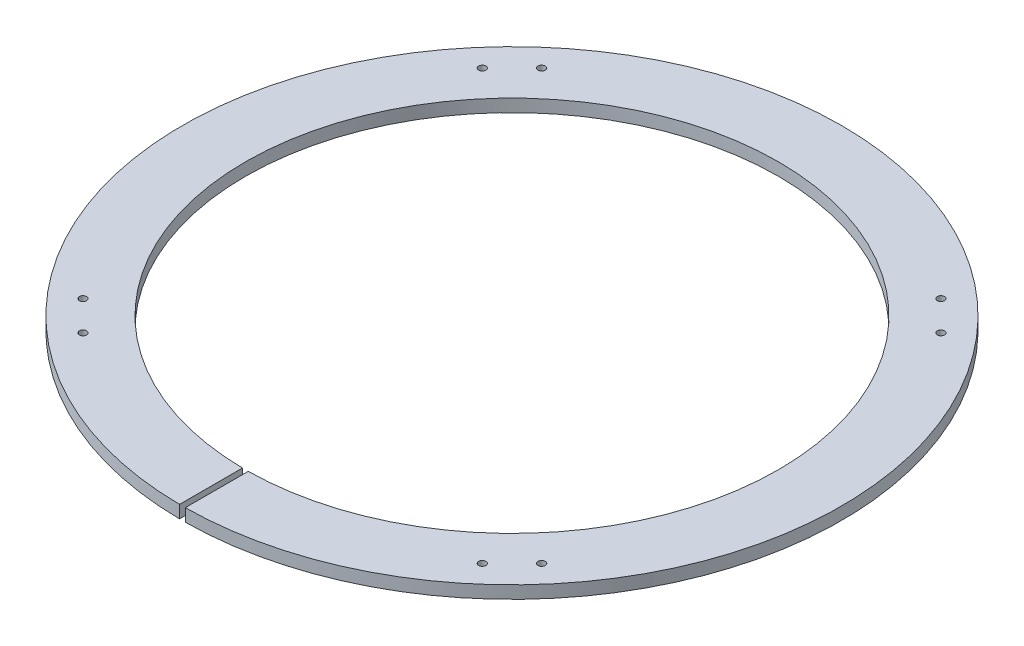
ISO-10303-21;
HEADER;
FILE_DESCRIPTION(('STEP AP214'),'2;1');
FILE_NAME('part.step','',(''),(''),'','','');
FILE_SCHEMA(('AUTOMOTIVE_DESIGN { 1 0 10303 214 1 1 1 1 }'));
ENDSEC;
DATA;
#1=APPLICATION_CONTEXT('core data for automotive mechanical design processes');
#2=APPLICATION_PROTOCOL_DEFINITION('international standard','automotive_design',2000,#1);
#3=PRODUCT_CONTEXT('',#1,'mechanical');
#4=PRODUCT('Part','Part','',(#3));
#5=PRODUCT_RELATED_PRODUCT_CATEGORY('part','',(#4));
#6=PRODUCT_DEFINITION_FORMATION('','',#4);
#7=PRODUCT_DEFINITION_CONTEXT('part definition',#1,'design');
#8=PRODUCT_DEFINITION('design','',#6,#7);
#9=PRODUCT_DEFINITION_SHAPE('','',#8);
#10=(LENGTH_UNIT() NAMED_UNIT(*) SI_UNIT(.MILLI.,.METRE.));
#11=(NAMED_UNIT(*) PLANE_ANGLE_UNIT() SI_UNIT($,.RADIAN.));
#12=(NAMED_UNIT(*) SI_UNIT($,.STERADIAN.) SOLID_ANGLE_UNIT());
#13=UNCERTAINTY_MEASURE_WITH_UNIT(LENGTH_MEASURE(1.E-05),#10,'distance_accuracy_value','');
#14=(GEOMETRIC_REPRESENTATION_CONTEXT(3) GLOBAL_UNCERTAINTY_ASSIGNED_CONTEXT((#13)) GLOBAL_UNIT_ASSIGNED_CONTEXT((#10,
#11,#12)) REPRESENTATION_CONTEXT('',''));
#15=CARTESIAN_POINT('',(0.,0.,0.));
#16=DIRECTION('',(0.,0.,1.));
#17=DIRECTION('',(1.,0.,0.));
#18=AXIS2_PLACEMENT_3D('',#15,#16,#17);
#19=CARTESIAN_POINT('',(0.,12.,0.));
#20=DIRECTION('',(0.,1.,0.));
#21=DIRECTION('',(0.,0.,1.));
#22=AXIS2_PLACEMENT_3D('',#19,#20,#21);
#23=PLANE('',#22);
#24=CARTESIAN_POINT('',(218.495995386646,12.,-190.211724139178));
#25=DIRECTION('',(0.,1.,0.));
#26=DIRECTION('',(1.,0.,0.));
#27=AXIS2_PLACEMENT_3D('',#24,#25,#26);
#28=CIRCLE('',#27,3.45);
#29=CARTESIAN_POINT('',(221.945995386646,12.,-190.211724139178));
#30=VERTEX_POINT('',#29);
#31=EDGE_CURVE('E133',#30,#30,#28,.T.);
#32=ORIENTED_EDGE('',*,*,#31,.F.);
#33=EDGE_LOOP('',(#32));
#34=FACE_BOUND('',#33,.T.);
#35=CARTESIAN_POINT('',(-218.495995386642,12.,-190.211724139182));
#36=DIRECTION('',(0.,1.,0.));
#37=DIRECTION('',(0.,0.,-1.));
#38=AXIS2_PLACEMENT_3D('',#35,#36,#37);
#39=CIRCLE('',#38,3.45);
#40=CARTESIAN_POINT('',(-218.495995386642,12.,-193.661724139182));
#41=VERTEX_POINT('',#40);
#42=EDGE_CURVE('E140',#41,#41,#39,.T.);
#43=ORIENTED_EDGE('',*,*,#42,.F.);
#44=EDGE_LOOP('',(#43));
#45=FACE_BOUND('',#44,.T.);
#46=CARTESIAN_POINT('',(-190.21172413918,12.,-218.495995386644));
#47=DIRECTION('',(0.,1.,0.));
#48=DIRECTION('',(0.,0.,-1.));
#49=AXIS2_PLACEMENT_3D('',#46,#47,#48);
#50=CIRCLE('',#49,3.45);
#51=CARTESIAN_POINT('',(-190.21172413918,12.,-221.945995386644));
#52=VERTEX_POINT('',#51);
#53=EDGE_CURVE('E121',#52,#52,#50,.T.);
#54=ORIENTED_EDGE('',*,*,#53,.F.);
#55=EDGE_LOOP('',(#54));
#56=FACE_BOUND('',#55,.T.);
#57=CARTESIAN_POINT('',(-190.211724139183,12.,218.495995386641));
#58=DIRECTION('',(0.,1.,0.));
#59=DIRECTION('',(-1.,0.,0.));
#60=AXIS2_PLACEMENT_3D('',#57,#58,#59);
#61=CIRCLE('',#60,3.45);
#62=CARTESIAN_POINT('',(-193.661724139183,12.,218.495995386641));
#63=VERTEX_POINT('',#62);
#64=EDGE_CURVE('E128',#63,#63,#61,.T.);
#65=ORIENTED_EDGE('',*,*,#64,.F.);
#66=EDGE_LOOP('',(#65));
#67=FACE_BOUND('',#66,.T.);
#68=CARTESIAN_POINT('',(190.211724139185,12.,-218.49599538664));
#69=DIRECTION('',(0.,1.,0.));
#70=DIRECTION('',(1.,0.,0.));
#71=AXIS2_PLACEMENT_3D('',#68,#69,#70);
#72=CIRCLE('',#71,3.45);
#73=CARTESIAN_POINT('',(193.661724139185,12.,-218.49599538664));
#74=VERTEX_POINT('',#73);
#75=EDGE_CURVE('E145',#74,#74,#72,.T.);
#76=ORIENTED_EDGE('',*,*,#75,.F.);
#77=EDGE_LOOP('',(#76));
#78=FACE_BOUND('',#77,.T.);
#79=CARTESIAN_POINT('',(-218.495995386645,12.,190.211724139179));
#80=DIRECTION('',(0.,1.,0.));
#81=DIRECTION('',(-1.,0.,0.));
#82=AXIS2_PLACEMENT_3D('',#79,#80,#81);
#83=CIRCLE('',#82,3.45);
#84=CARTESIAN_POINT('',(-221.945995386645,12.,190.211724139179));
#85=VERTEX_POINT('',#84);
#86=EDGE_CURVE('E115',#85,#85,#83,.T.);
#87=ORIENTED_EDGE('',*,*,#86,.F.);
#88=EDGE_LOOP('',(#87));
#89=FACE_BOUND('',#88,.T.);
#90=CARTESIAN_POINT('',(190.21172413918,12.,218.495995386644));
#91=DIRECTION('',(0.,1.,0.));
#92=DIRECTION('',(0.,0.,1.));
#93=AXIS2_PLACEMENT_3D('',#90,#91,#92);
#94=CIRCLE('',#93,3.45);
#95=CARTESIAN_POINT('',(190.21172413918,12.,221.945995386644));
#96=VERTEX_POINT('',#95);
#97=EDGE_CURVE('E110',#96,#96,#94,.T.);
#98=ORIENTED_EDGE('',*,*,#97,.F.);
#99=EDGE_LOOP('',(#98));
#100=FACE_BOUND('',#99,.T.);
#101=CARTESIAN_POINT('',(218.495995386642,12.,190.211724139182));
#102=DIRECTION('',(0.,1.,0.));
#103=DIRECTION('',(0.,0.,1.));
#104=AXIS2_PLACEMENT_3D('',#101,#102,#103);
#105=CIRCLE('',#104,3.45);
#106=CARTESIAN_POINT('',(218.495995386642,12.,193.661724139182));
#107=VERTEX_POINT('',#106);
#108=EDGE_CURVE('E103',#107,#107,#105,.T.);
#109=ORIENTED_EDGE('',*,*,#108,.F.);
#110=EDGE_LOOP('',(#109));
#111=FACE_BOUND('',#110,.T.);
#112=DIRECTION('',(0.,0.,-1.));
#113=VECTOR('',#112,1.);
#114=CARTESIAN_POINT('',(2.7449087635425,12.,234.638796625747));
#115=LINE('',#114,#113);
#116=CARTESIAN_POINT('',(2.74490876354251,12.,313.988002120909));
#117=VERTEX_POINT('',#116);
#118=CARTESIAN_POINT('',(2.7449087635425,12.,253.985167826548));
#119=VERTEX_POINT('',#118);
#120=EDGE_CURVE('E54',#117,#119,#115,.T.);
#121=ORIENTED_EDGE('',*,*,#120,.F.);
#122=CARTESIAN_POINT('',(0.,12.,0.));
#123=DIRECTION('',(0.,1.,0.));
#124=DIRECTION('',(0.,0.,1.));
#125=AXIS2_PLACEMENT_3D('',#122,#123,#124);
#126=CIRCLE('',#125,314.);
#127=CARTESIAN_POINT('',(-2.7449087635425,12.,313.988002120909));
#128=VERTEX_POINT('',#127);
#129=EDGE_CURVE('E85',#117,#128,#126,.T.);
#130=ORIENTED_EDGE('',*,*,#129,.T.);
#131=DIRECTION('',(0.,0.,1.));
#132=VECTOR('',#131,1.);
#133=CARTESIAN_POINT('',(-2.7449087635425,12.,234.638796625747));
#134=LINE('',#133,#132);
#135=CARTESIAN_POINT('',(-2.7449087635425,12.,253.985167826548));
#136=VERTEX_POINT('',#135);
#137=EDGE_CURVE('E88',#136,#128,#134,.T.);
#138=ORIENTED_EDGE('',*,*,#137,.F.);
#139=CARTESIAN_POINT('',(0.,12.,0.));
#140=DIRECTION('',(0.,1.,0.));
#141=DIRECTION('',(0.,0.,1.));
#142=AXIS2_PLACEMENT_3D('',#139,#140,#141);
#143=CIRCLE('',#142,254.);
#144=EDGE_CURVE('E87',#119,#136,#143,.T.);
#145=ORIENTED_EDGE('',*,*,#144,.F.);
#146=EDGE_LOOP('',(#121,#130,#138,#145));
#147=FACE_BOUND('',#146,.T.);
#148=ADVANCED_FACE('F32',(#34,#45,#56,#67,#78,#89,#100,#111,#147),#23,.T.);
#149=CARTESIAN_POINT('',(0.,0.,0.));
#150=DIRECTION('',(0.,1.,0.));
#151=DIRECTION('',(0.,0.,1.));
#152=AXIS2_PLACEMENT_3D('',#149,#150,#151);
#153=PLANE('',#152);
#154=CARTESIAN_POINT('',(218.495995386646,0.,-190.211724139178));
#155=DIRECTION('',(0.,1.,0.));
#156=DIRECTION('',(1.,0.,0.));
#157=AXIS2_PLACEMENT_3D('',#154,#155,#156);
#158=CIRCLE('',#157,3.45);
#159=CARTESIAN_POINT('',(221.945995386646,0.,-190.211724139178));
#160=VERTEX_POINT('',#159);
#161=EDGE_CURVE('E136',#160,#160,#158,.T.);
#162=ORIENTED_EDGE('',*,*,#161,.T.);
#163=EDGE_LOOP('',(#162));
#164=FACE_BOUND('',#163,.T.);
#165=CARTESIAN_POINT('',(-218.495995386642,0.,-190.211724139182));
#166=DIRECTION('',(0.,1.,0.));
#167=DIRECTION('',(0.,0.,-1.));
#168=AXIS2_PLACEMENT_3D('',#165,#166,#167);
#169=CIRCLE('',#168,3.45);
#170=CARTESIAN_POINT('',(-218.495995386642,0.,-193.661724139182));
#171=VERTEX_POINT('',#170);
#172=EDGE_CURVE('E125',#171,#171,#169,.T.);
#173=ORIENTED_EDGE('',*,*,#172,.T.);
#174=EDGE_LOOP('',(#173));
#175=FACE_BOUND('',#174,.T.);
#176=CARTESIAN_POINT('',(-190.21172413918,0.,-218.495995386644));
#177=DIRECTION('',(0.,1.,0.));
#178=DIRECTION('',(0.,0.,-1.));
#179=AXIS2_PLACEMENT_3D('',#176,#177,#178);
#180=CIRCLE('',#179,3.45);
#181=CARTESIAN_POINT('',(-190.21172413918,0.,-221.945995386644));
#182=VERTEX_POINT('',#181);
#183=EDGE_CURVE('E124',#182,#182,#180,.T.);
#184=ORIENTED_EDGE('',*,*,#183,.T.);
#185=EDGE_LOOP('',(#184));
#186=FACE_BOUND('',#185,.T.);
#187=CARTESIAN_POINT('',(-190.211724139183,0.,218.495995386641));
#188=DIRECTION('',(0.,1.,0.));
#189=DIRECTION('',(-1.,0.,0.));
#190=AXIS2_PLACEMENT_3D('',#187,#188,#189);
#191=CIRCLE('',#190,3.45);
#192=CARTESIAN_POINT('',(-193.661724139183,0.,218.495995386641));
#193=VERTEX_POINT('',#192);
#194=EDGE_CURVE('E118',#193,#193,#191,.T.);
#195=ORIENTED_EDGE('',*,*,#194,.T.);
#196=EDGE_LOOP('',(#195));
#197=FACE_BOUND('',#196,.T.);
#198=CARTESIAN_POINT('',(190.211724139185,0.,-218.49599538664));
#199=DIRECTION('',(0.,1.,0.));
#200=DIRECTION('',(1.,0.,0.));
#201=AXIS2_PLACEMENT_3D('',#198,#199,#200);
#202=CIRCLE('',#201,3.45);
#203=CARTESIAN_POINT('',(193.661724139185,0.,-218.49599538664));
#204=VERTEX_POINT('',#203);
#205=EDGE_CURVE('E137',#204,#204,#202,.T.);
#206=ORIENTED_EDGE('',*,*,#205,.T.);
#207=EDGE_LOOP('',(#206));
#208=FACE_BOUND('',#207,.T.);
#209=CARTESIAN_POINT('',(-218.495995386645,0.,190.211724139179));
#210=DIRECTION('',(0.,1.,0.));
#211=DIRECTION('',(-1.,0.,0.));
#212=AXIS2_PLACEMENT_3D('',#209,#210,#211);
#213=CIRCLE('',#212,3.45);
#214=CARTESIAN_POINT('',(-221.945995386645,0.,190.211724139179));
#215=VERTEX_POINT('',#214);
#216=EDGE_CURVE('E107',#215,#215,#213,.T.);
#217=ORIENTED_EDGE('',*,*,#216,.T.);
#218=EDGE_LOOP('',(#217));
#219=FACE_BOUND('',#218,.T.);
#220=CARTESIAN_POINT('',(190.21172413918,0.,218.495995386644));
#221=DIRECTION('',(0.,1.,0.));
#222=DIRECTION('',(0.,0.,1.));
#223=AXIS2_PLACEMENT_3D('',#220,#221,#222);
#224=CIRCLE('',#223,3.45);
#225=CARTESIAN_POINT('',(190.21172413918,0.,221.945995386644));
#226=VERTEX_POINT('',#225);
#227=EDGE_CURVE('E89',#226,#226,#224,.T.);
#228=ORIENTED_EDGE('',*,*,#227,.T.);
#229=EDGE_LOOP('',(#228));
#230=FACE_BOUND('',#229,.T.);
#231=CARTESIAN_POINT('',(218.495995386642,0.,190.211724139182));
#232=DIRECTION('',(0.,1.,0.));
#233=DIRECTION('',(0.,0.,1.));
#234=AXIS2_PLACEMENT_3D('',#231,#232,#233);
#235=CIRCLE('',#234,3.45);
#236=CARTESIAN_POINT('',(218.495995386642,0.,193.661724139182));
#237=VERTEX_POINT('',#236);
#238=EDGE_CURVE('E106',#237,#237,#235,.T.);
#239=ORIENTED_EDGE('',*,*,#238,.T.);
#240=EDGE_LOOP('',(#239));
#241=FACE_BOUND('',#240,.T.);
#242=CARTESIAN_POINT('',(0.,0.,0.));
#243=DIRECTION('',(0.,1.,0.));
#244=DIRECTION('',(0.,0.,1.));
#245=AXIS2_PLACEMENT_3D('',#242,#243,#244);
#246=CIRCLE('',#245,314.);
#247=CARTESIAN_POINT('',(2.74490876354251,0.,313.988002120909));
#248=VERTEX_POINT('',#247);
#249=CARTESIAN_POINT('',(-2.7449087635425,0.,313.988002120909));
#250=VERTEX_POINT('',#249);
#251=EDGE_CURVE('E92',#248,#250,#246,.T.);
#252=ORIENTED_EDGE('',*,*,#251,.F.);
#253=DIRECTION('',(0.,0.,-1.));
#254=VECTOR('',#253,1.);
#255=CARTESIAN_POINT('',(2.7449087635425,0.,234.638796625747));
#256=LINE('',#255,#254);
#257=CARTESIAN_POINT('',(2.7449087635425,0.,253.985167826548));
#258=VERTEX_POINT('',#257);
#259=EDGE_CURVE('E73',#248,#258,#256,.T.);
#260=ORIENTED_EDGE('',*,*,#259,.T.);
#261=CARTESIAN_POINT('',(0.,0.,0.));
#262=DIRECTION('',(0.,1.,0.));
#263=DIRECTION('',(0.,0.,1.));
#264=AXIS2_PLACEMENT_3D('',#261,#262,#263);
#265=CIRCLE('',#264,254.);
#266=CARTESIAN_POINT('',(-2.7449087635425,0.,253.985167826548));
#267=VERTEX_POINT('',#266);
#268=EDGE_CURVE('E78',#258,#267,#265,.T.);
#269=ORIENTED_EDGE('',*,*,#268,.T.);
#270=DIRECTION('',(0.,0.,1.));
#271=VECTOR('',#270,1.);
#272=CARTESIAN_POINT('',(-2.7449087635425,0.,234.638796625747));
#273=LINE('',#272,#271);
#274=EDGE_CURVE('E47',#267,#250,#273,.T.);
#275=ORIENTED_EDGE('',*,*,#274,.T.);
#276=EDGE_LOOP('',(#252,#260,#269,#275));
#277=FACE_BOUND('',#276,.T.);
#278=ADVANCED_FACE('F151',(#164,#175,#186,#197,#208,#219,#230,#241,#277),#153,.F.);
#279=CARTESIAN_POINT('',(0.,12.,0.));
#280=DIRECTION('',(0.,-1.,0.));
#281=DIRECTION('',(0.,0.,-1.));
#282=AXIS2_PLACEMENT_3D('',#279,#280,#281);
#283=CYLINDRICAL_SURFACE('',#282,314.);
#284=ORIENTED_EDGE('',*,*,#129,.F.);
#285=DIRECTION('',(0.,-1.,0.));
#286=VECTOR('',#285,1.);
#287=CARTESIAN_POINT('',(2.74490876354251,12.,313.988002120909));
#288=LINE('',#287,#286);
#289=EDGE_CURVE('E70',#117,#248,#288,.T.);
#290=ORIENTED_EDGE('',*,*,#289,.T.);
#291=ORIENTED_EDGE('',*,*,#251,.T.);
#292=DIRECTION('',(0.,-1.,0.));
#293=VECTOR('',#292,1.);
#294=CARTESIAN_POINT('',(-2.7449087635425,12.,313.988002120909));
#295=LINE('',#294,#293);
#296=EDGE_CURVE('E79',#250,#128,#295,.F.);
#297=ORIENTED_EDGE('',*,*,#296,.T.);
#298=EDGE_LOOP('',(#284,#290,#291,#297));
#299=FACE_BOUND('',#298,.T.);
#300=ADVANCED_FACE('F34',(#299),#283,.T.);
#301=CARTESIAN_POINT('',(0.,12.,0.));
#302=DIRECTION('',(0.,-1.,0.));
#303=DIRECTION('',(0.,0.,-1.));
#304=AXIS2_PLACEMENT_3D('',#301,#302,#303);
#305=CYLINDRICAL_SURFACE('',#304,254.);
#306=DIRECTION('',(0.,-1.,0.));
#307=VECTOR('',#306,1.);
#308=CARTESIAN_POINT('',(2.7449087635425,12.,253.985167826548));
#309=LINE('',#308,#307);
#310=EDGE_CURVE('E11',#119,#258,#309,.T.);
#311=ORIENTED_EDGE('',*,*,#310,.F.);
#312=ORIENTED_EDGE('',*,*,#144,.T.);
#313=DIRECTION('',(0.,-1.,0.));
#314=VECTOR('',#313,1.);
#315=CARTESIAN_POINT('',(-2.7449087635425,12.,253.985167826548));
#316=LINE('',#315,#314);
#317=EDGE_CURVE('E40',#267,#136,#316,.F.);
#318=ORIENTED_EDGE('',*,*,#317,.F.);
#319=ORIENTED_EDGE('',*,*,#268,.F.);
#320=EDGE_LOOP('',(#311,#312,#318,#319));
#321=FACE_BOUND('',#320,.T.);
#322=ADVANCED_FACE('F189',(#321),#305,.F.);
#323=CARTESIAN_POINT('',(-2.7449087635425,0.,234.638796625747));
#324=DIRECTION('',(-1.,0.,0.));
#325=DIRECTION('',(0.,0.,1.));
#326=AXIS2_PLACEMENT_3D('',#323,#324,#325);
#327=PLANE('',#326);
#328=ORIENTED_EDGE('',*,*,#274,.F.);
#329=ORIENTED_EDGE('',*,*,#317,.T.);
#330=ORIENTED_EDGE('',*,*,#137,.T.);
#331=ORIENTED_EDGE('',*,*,#296,.F.);
#332=EDGE_LOOP('',(#328,#329,#330,#331));
#333=FACE_BOUND('',#332,.T.);
#334=ADVANCED_FACE('F183',(#333),#327,.F.);
#335=CARTESIAN_POINT('',(2.7449087635425,0.,234.638796625747));
#336=DIRECTION('',(1.,0.,0.));
#337=DIRECTION('',(0.,0.,-1.));
#338=AXIS2_PLACEMENT_3D('',#335,#336,#337);
#339=PLANE('',#338);
#340=ORIENTED_EDGE('',*,*,#120,.T.);
#341=ORIENTED_EDGE('',*,*,#310,.T.);
#342=ORIENTED_EDGE('',*,*,#259,.F.);
#343=ORIENTED_EDGE('',*,*,#289,.F.);
#344=EDGE_LOOP('',(#340,#341,#342,#343));
#345=FACE_BOUND('',#344,.T.);
#346=ADVANCED_FACE('F71',(#345),#339,.F.);
#347=CARTESIAN_POINT('',(218.495995386642,0.,190.211724139182));
#348=DIRECTION('',(0.,1.,0.));
#349=DIRECTION('',(0.,0.,1.));
#350=AXIS2_PLACEMENT_3D('',#347,#348,#349);
#351=CYLINDRICAL_SURFACE('',#350,3.45);
#352=ORIENTED_EDGE('',*,*,#238,.F.);
#353=EDGE_LOOP('',(#352));
#354=FACE_BOUND('',#353,.T.);
#355=ORIENTED_EDGE('',*,*,#108,.T.);
#356=EDGE_LOOP('',(#355));
#357=FACE_BOUND('',#356,.T.);
#358=ADVANCED_FACE('F172',(#354,#357),#351,.F.);
#359=CARTESIAN_POINT('',(190.21172413918,0.,218.495995386644));
#360=DIRECTION('',(0.,1.,0.));
#361=DIRECTION('',(0.,0.,1.));
#362=AXIS2_PLACEMENT_3D('',#359,#360,#361);
#363=CYLINDRICAL_SURFACE('',#362,3.45);
#364=ORIENTED_EDGE('',*,*,#227,.F.);
#365=EDGE_LOOP('',(#364));
#366=FACE_BOUND('',#365,.T.);
#367=ORIENTED_EDGE('',*,*,#97,.T.);
#368=EDGE_LOOP('',(#367));
#369=FACE_BOUND('',#368,.T.);
#370=ADVANCED_FACE('F174',(#366,#369),#363,.F.);
#371=CARTESIAN_POINT('',(-218.495995386645,0.,190.211724139179));
#372=DIRECTION('',(0.,1.,0.));
#373=DIRECTION('',(0.,0.,1.));
#374=AXIS2_PLACEMENT_3D('',#371,#372,#373);
#375=CYLINDRICAL_SURFACE('',#374,3.45);
#376=ORIENTED_EDGE('',*,*,#216,.F.);
#377=EDGE_LOOP('',(#376));
#378=FACE_BOUND('',#377,.T.);
#379=ORIENTED_EDGE('',*,*,#86,.T.);
#380=EDGE_LOOP('',(#379));
#381=FACE_BOUND('',#380,.T.);
#382=ADVANCED_FACE('F158',(#378,#381),#375,.F.);
#383=CARTESIAN_POINT('',(190.211724139185,0.,-218.49599538664));
#384=DIRECTION('',(0.,1.,0.));
#385=DIRECTION('',(0.,0.,1.));
#386=AXIS2_PLACEMENT_3D('',#383,#384,#385);
#387=CYLINDRICAL_SURFACE('',#386,3.45);
#388=ORIENTED_EDGE('',*,*,#205,.F.);
#389=EDGE_LOOP('',(#388));
#390=FACE_BOUND('',#389,.T.);
#391=ORIENTED_EDGE('',*,*,#75,.T.);
#392=EDGE_LOOP('',(#391));
#393=FACE_BOUND('',#392,.T.);
#394=ADVANCED_FACE('F154',(#390,#393),#387,.F.);
#395=CARTESIAN_POINT('',(-190.211724139183,0.,218.495995386641));
#396=DIRECTION('',(0.,1.,0.));
#397=DIRECTION('',(0.,0.,1.));
#398=AXIS2_PLACEMENT_3D('',#395,#396,#397);
#399=CYLINDRICAL_SURFACE('',#398,3.45);
#400=ORIENTED_EDGE('',*,*,#194,.F.);
#401=EDGE_LOOP('',(#400));
#402=FACE_BOUND('',#401,.T.);
#403=ORIENTED_EDGE('',*,*,#64,.T.);
#404=EDGE_LOOP('',(#403));
#405=FACE_BOUND('',#404,.T.);
#406=ADVANCED_FACE('F157',(#402,#405),#399,.F.);
#407=CARTESIAN_POINT('',(-190.21172413918,0.,-218.495995386644));
#408=DIRECTION('',(0.,1.,0.));
#409=DIRECTION('',(0.,0.,1.));
#410=AXIS2_PLACEMENT_3D('',#407,#408,#409);
#411=CYLINDRICAL_SURFACE('',#410,3.45);
#412=ORIENTED_EDGE('',*,*,#183,.F.);
#413=EDGE_LOOP('',(#412));
#414=FACE_BOUND('',#413,.T.);
#415=ORIENTED_EDGE('',*,*,#53,.T.);
#416=EDGE_LOOP('',(#415));
#417=FACE_BOUND('',#416,.T.);
#418=ADVANCED_FACE('F208',(#414,#417),#411,.F.);
#419=CARTESIAN_POINT('',(-218.495995386642,0.,-190.211724139182));
#420=DIRECTION('',(0.,1.,0.));
#421=DIRECTION('',(0.,0.,1.));
#422=AXIS2_PLACEMENT_3D('',#419,#420,#421);
#423=CYLINDRICAL_SURFACE('',#422,3.45);
#424=ORIENTED_EDGE('',*,*,#172,.F.);
#425=EDGE_LOOP('',(#424));
#426=FACE_BOUND('',#425,.T.);
#427=ORIENTED_EDGE('',*,*,#42,.T.);
#428=EDGE_LOOP('',(#427));
#429=FACE_BOUND('',#428,.T.);
#430=ADVANCED_FACE('F215',(#426,#429),#423,.F.);
#431=CARTESIAN_POINT('',(218.495995386646,0.,-190.211724139178));
#432=DIRECTION('',(0.,1.,0.));
#433=DIRECTION('',(0.,0.,1.));
#434=AXIS2_PLACEMENT_3D('',#431,#432,#433);
#435=CYLINDRICAL_SURFACE('',#434,3.45);
#436=ORIENTED_EDGE('',*,*,#161,.F.);
#437=EDGE_LOOP('',(#436));
#438=FACE_BOUND('',#437,.T.);
#439=ORIENTED_EDGE('',*,*,#31,.T.);
#440=EDGE_LOOP('',(#439));
#441=FACE_BOUND('',#440,.T.);
#442=ADVANCED_FACE('F219',(#438,#441),#435,.F.);
#443=CLOSED_SHELL('',(#148,#278,#300,#322,#334,#346,#358,#370,#382,#394,#406,#418,#430,#442));
#444=MANIFOLD_SOLID_BREP('B2',#443);
#445=ADVANCED_BREP_SHAPE_REPRESENTATION('',(#18,#444),#14);
#446=SHAPE_DEFINITION_REPRESENTATION(#9,#445);
ENDSEC;
END-ISO-10303-21;
